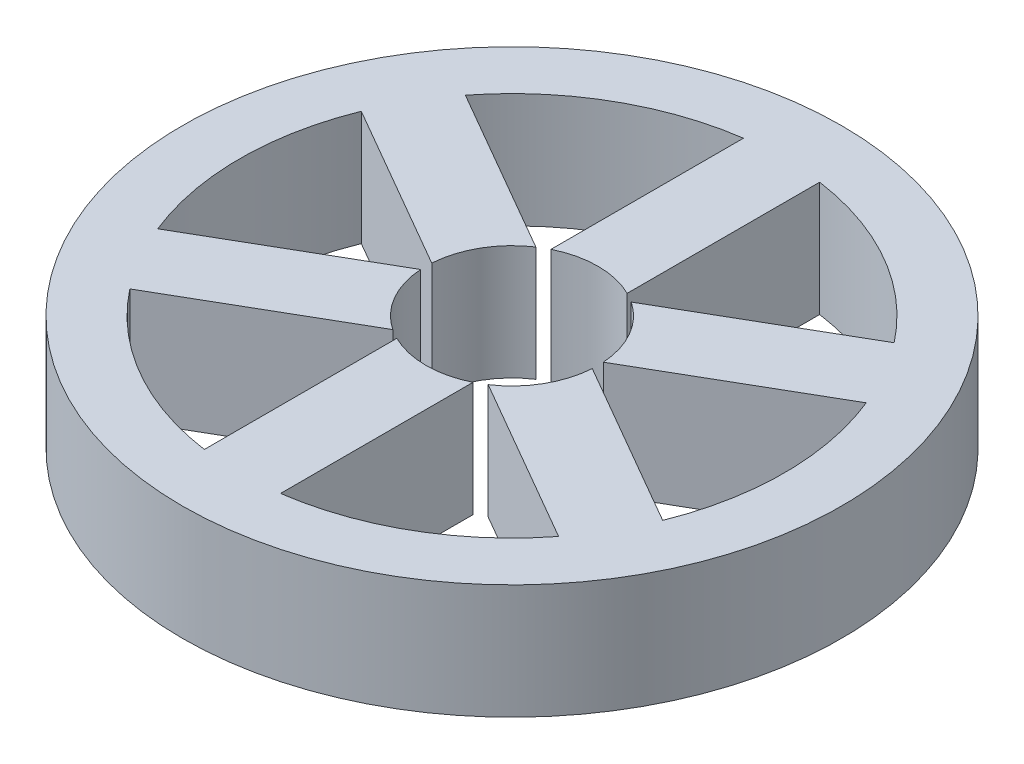
ISO-10303-21;
HEADER;
FILE_DESCRIPTION(('STEP AP214'),'2;1');
FILE_NAME('part.step','',(''),(''),'','','');
FILE_SCHEMA(('AUTOMOTIVE_DESIGN { 1 0 10303 214 1 1 1 1 }'));
ENDSEC;
DATA;
#1=APPLICATION_CONTEXT('core data for automotive mechanical design processes');
#2=APPLICATION_PROTOCOL_DEFINITION('international standard','automotive_design',2000,#1);
#3=PRODUCT_CONTEXT('',#1,'mechanical');
#4=PRODUCT('Part','Part','',(#3));
#5=PRODUCT_RELATED_PRODUCT_CATEGORY('part','',(#4));
#6=PRODUCT_DEFINITION_FORMATION('','',#4);
#7=PRODUCT_DEFINITION_CONTEXT('part definition',#1,'design');
#8=PRODUCT_DEFINITION('design','',#6,#7);
#9=PRODUCT_DEFINITION_SHAPE('','',#8);
#10=(LENGTH_UNIT() NAMED_UNIT(*) SI_UNIT(.MILLI.,.METRE.));
#11=(NAMED_UNIT(*) PLANE_ANGLE_UNIT() SI_UNIT($,.RADIAN.));
#12=(NAMED_UNIT(*) SI_UNIT($,.STERADIAN.) SOLID_ANGLE_UNIT());
#13=UNCERTAINTY_MEASURE_WITH_UNIT(LENGTH_MEASURE(1.E-05),#10,'distance_accuracy_value','');
#14=(GEOMETRIC_REPRESENTATION_CONTEXT(3) GLOBAL_UNCERTAINTY_ASSIGNED_CONTEXT((#13)) GLOBAL_UNIT_ASSIGNED_CONTEXT((#10,
#11,#12)) REPRESENTATION_CONTEXT('',''));
#15=CARTESIAN_POINT('',(0.,0.,0.));
#16=DIRECTION('',(0.,0.,1.));
#17=DIRECTION('',(1.,0.,0.));
#18=AXIS2_PLACEMENT_3D('',#15,#16,#17);
#19=CARTESIAN_POINT('',(0.,2.,0.));
#20=DIRECTION('',(0.,-1.,0.));
#21=DIRECTION('',(0.,0.,-1.));
#22=AXIS2_PLACEMENT_3D('',#19,#20,#21);
#23=CYLINDRICAL_SURFACE('',#22,4.75);
#24=CARTESIAN_POINT('',(0.,0.,0.));
#25=DIRECTION('',(0.,1.,0.));
#26=DIRECTION('',(0.,0.,1.));
#27=AXIS2_PLACEMENT_3D('',#24,#25,#26);
#28=CIRCLE('',#27,4.75);
#29=CARTESIAN_POINT('',(-3.74081986253042,0.,2.92724559203664));
#30=VERTEX_POINT('',#29);
#31=CARTESIAN_POINT('',(-0.664659114554616,0.,4.70326782795106));
#32=VERTEX_POINT('',#31);
#33=EDGE_CURVE('E285',#30,#32,#28,.T.);
#34=ORIENTED_EDGE('',*,*,#33,.F.);
#35=DIRECTION('',(0.,-1.,0.));
#36=VECTOR('',#35,1.);
#37=CARTESIAN_POINT('',(-3.74081986253042,2.,2.92724559203664));
#38=LINE('',#37,#36);
#39=CARTESIAN_POINT('',(-3.74081986253042,2.,2.92724559203664));
#40=VERTEX_POINT('',#39);
#41=EDGE_CURVE('E11',#40,#30,#38,.T.);
#42=ORIENTED_EDGE('',*,*,#41,.F.);
#43=CARTESIAN_POINT('',(0.,2.,0.));
#44=DIRECTION('',(0.,1.,0.));
#45=DIRECTION('',(0.,0.,1.));
#46=AXIS2_PLACEMENT_3D('',#43,#44,#45);
#47=CIRCLE('',#46,4.75);
#48=CARTESIAN_POINT('',(-0.664659114554616,2.,4.70326782795106));
#49=VERTEX_POINT('',#48);
#50=EDGE_CURVE('E243',#40,#49,#47,.T.);
#51=ORIENTED_EDGE('',*,*,#50,.T.);
#52=DIRECTION('',(0.,-1.,0.));
#53=VECTOR('',#52,1.);
#54=CARTESIAN_POINT('',(-0.664659114554616,2.,4.70326782795106));
#55=LINE('',#54,#53);
#56=EDGE_CURVE('E137',#49,#32,#55,.T.);
#57=ORIENTED_EDGE('',*,*,#56,.T.);
#58=EDGE_LOOP('',(#34,#42,#51,#57));
#59=FACE_BOUND('',#58,.T.);
#60=ADVANCED_FACE('F39',(#59),#23,.F.);
#61=CARTESIAN_POINT('',(0.332329557277286,2.,0.575611678061143));
#62=DIRECTION('',(0.499999999999992,0.,0.866025403784443));
#63=DIRECTION('',(0.866025403784443,0.,-0.499999999999992));
#64=AXIS2_PLACEMENT_3D('',#61,#62,#63);
#65=PLANE('',#64);
#66=DIRECTION('',(-0.866025403784443,0.,0.499999999999992));
#67=VECTOR('',#66,1.);
#68=CARTESIAN_POINT('',(0.332329557277286,0.,0.575611678061143));
#69=LINE('',#68,#67);
#70=CARTESIAN_POINT('',(-0.832218078536575,0.,1.2479635690824));
#71=VERTEX_POINT('',#70);
#72=EDGE_CURVE('E288',#71,#30,#69,.T.);
#73=ORIENTED_EDGE('',*,*,#72,.F.);
#74=DIRECTION('',(0.,-1.,0.));
#75=VECTOR('',#74,1.);
#76=CARTESIAN_POINT('',(-0.832218078536575,2.,1.2479635690824));
#77=LINE('',#76,#75);
#78=CARTESIAN_POINT('',(-0.832218078536575,2.,1.2479635690824));
#79=VERTEX_POINT('',#78);
#80=EDGE_CURVE('E47',#79,#71,#77,.T.);
#81=ORIENTED_EDGE('',*,*,#80,.F.);
#82=DIRECTION('',(-0.866025403784443,0.,0.499999999999992));
#83=VECTOR('',#82,1.);
#84=CARTESIAN_POINT('',(0.332329557277286,2.,0.575611678061143));
#85=LINE('',#84,#83);
#86=EDGE_CURVE('E237',#79,#40,#85,.T.);
#87=ORIENTED_EDGE('',*,*,#86,.T.);
#88=ORIENTED_EDGE('',*,*,#41,.T.);
#89=EDGE_LOOP('',(#73,#81,#87,#88));
#90=FACE_BOUND('',#89,.T.);
#91=ADVANCED_FACE('F390',(#90),#65,.T.);
#92=CARTESIAN_POINT('',(0.,2.,0.));
#93=DIRECTION('',(0.,-1.,0.));
#94=DIRECTION('',(0.,0.,-1.));
#95=AXIS2_PLACEMENT_3D('',#92,#93,#94);
#96=CYLINDRICAL_SURFACE('',#95,1.5);
#97=CARTESIAN_POINT('',(0.,0.,0.));
#98=DIRECTION('',(0.,1.,0.));
#99=DIRECTION('',(0.,0.,1.));
#100=AXIS2_PLACEMENT_3D('',#97,#98,#99);
#101=CIRCLE('',#100,1.5);
#102=CARTESIAN_POINT('',(-1.49687719309115,0.,0.0967402129601177));
#103=VERTEX_POINT('',#102);
#104=EDGE_CURVE('E291',#103,#71,#101,.T.);
#105=ORIENTED_EDGE('',*,*,#104,.F.);
#106=DIRECTION('',(0.,-1.,0.));
#107=VECTOR('',#106,1.);
#108=CARTESIAN_POINT('',(-1.49687719309115,2.,0.0967402129601177));
#109=LINE('',#108,#107);
#110=CARTESIAN_POINT('',(-1.49687719309115,2.,0.0967402129601177));
#111=VERTEX_POINT('',#110);
#112=EDGE_CURVE('E384',#111,#103,#109,.T.);
#113=ORIENTED_EDGE('',*,*,#112,.F.);
#114=CARTESIAN_POINT('',(0.,2.,0.));
#115=DIRECTION('',(0.,1.,0.));
#116=DIRECTION('',(0.,0.,1.));
#117=AXIS2_PLACEMENT_3D('',#114,#115,#116);
#118=CIRCLE('',#117,1.5);
#119=EDGE_CURVE('E226',#111,#79,#118,.T.);
#120=ORIENTED_EDGE('',*,*,#119,.T.);
#121=ORIENTED_EDGE('',*,*,#80,.T.);
#122=EDGE_LOOP('',(#105,#113,#120,#121));
#123=FACE_BOUND('',#122,.T.);
#124=ADVANCED_FACE('F387',(#123),#96,.F.);
#125=CARTESIAN_POINT('',(-0.332329557277286,2.,-0.575611678061143));
#126=DIRECTION('',(0.499999999999992,0.,0.866025403784443));
#127=DIRECTION('',(0.866025403784443,0.,-0.499999999999992));
#128=AXIS2_PLACEMENT_3D('',#125,#126,#127);
#129=PLANE('',#128);
#130=DIRECTION('',(-0.866025403784443,0.,0.499999999999992));
#131=VECTOR('',#130,1.);
#132=CARTESIAN_POINT('',(-0.332329557277286,0.,-0.575611678061143));
#133=LINE('',#132,#131);
#134=CARTESIAN_POINT('',(-4.40547897708499,0.,1.77602223591435));
#135=VERTEX_POINT('',#134);
#136=EDGE_CURVE('E294',#103,#135,#133,.T.);
#137=ORIENTED_EDGE('',*,*,#136,.T.);
#138=DIRECTION('',(0.,-1.,0.));
#139=VECTOR('',#138,1.);
#140=CARTESIAN_POINT('',(-4.40547897708499,2.,1.77602223591435));
#141=LINE('',#140,#139);
#142=CARTESIAN_POINT('',(-4.40547897708499,2.,1.77602223591435));
#143=VERTEX_POINT('',#142);
#144=EDGE_CURVE('E382',#143,#135,#141,.T.);
#145=ORIENTED_EDGE('',*,*,#144,.F.);
#146=DIRECTION('',(-0.866025403784443,0.,0.499999999999992));
#147=VECTOR('',#146,1.);
#148=CARTESIAN_POINT('',(-0.332329557277286,2.,-0.575611678061143));
#149=LINE('',#148,#147);
#150=EDGE_CURVE('E236',#111,#143,#149,.T.);
#151=ORIENTED_EDGE('',*,*,#150,.F.);
#152=ORIENTED_EDGE('',*,*,#112,.T.);
#153=EDGE_LOOP('',(#137,#145,#151,#152));
#154=FACE_BOUND('',#153,.T.);
#155=ADVANCED_FACE('F398',(#154),#129,.F.);
#156=CARTESIAN_POINT('',(0.,2.,0.));
#157=DIRECTION('',(0.,-1.,0.));
#158=DIRECTION('',(0.,0.,-1.));
#159=AXIS2_PLACEMENT_3D('',#156,#157,#158);
#160=CYLINDRICAL_SURFACE('',#159,4.75);
#161=CARTESIAN_POINT('',(0.,0.,0.));
#162=DIRECTION('',(0.,1.,0.));
#163=DIRECTION('',(0.,0.,1.));
#164=AXIS2_PLACEMENT_3D('',#161,#162,#163);
#165=CIRCLE('',#164,4.75);
#166=CARTESIAN_POINT('',(-4.40547897708495,0.,-1.77602223591444));
#167=VERTEX_POINT('',#166);
#168=EDGE_CURVE('E299',#167,#135,#165,.T.);
#169=ORIENTED_EDGE('',*,*,#168,.F.);
#170=DIRECTION('',(0.,-1.,0.));
#171=VECTOR('',#170,1.);
#172=CARTESIAN_POINT('',(-4.40547897708495,2.,-1.77602223591444));
#173=LINE('',#172,#171);
#174=CARTESIAN_POINT('',(-4.40547897708495,2.,-1.77602223591444));
#175=VERTEX_POINT('',#174);
#176=EDGE_CURVE('E380',#175,#167,#173,.T.);
#177=ORIENTED_EDGE('',*,*,#176,.F.);
#178=CARTESIAN_POINT('',(0.,2.,0.));
#179=DIRECTION('',(0.,1.,0.));
#180=DIRECTION('',(0.,0.,1.));
#181=AXIS2_PLACEMENT_3D('',#178,#179,#180);
#182=CIRCLE('',#181,4.75);
#183=EDGE_CURVE('E241',#175,#143,#182,.T.);
#184=ORIENTED_EDGE('',*,*,#183,.T.);
#185=ORIENTED_EDGE('',*,*,#144,.T.);
#186=EDGE_LOOP('',(#169,#177,#184,#185));
#187=FACE_BOUND('',#186,.T.);
#188=ADVANCED_FACE('F415',(#187),#160,.F.);
#189=CARTESIAN_POINT('',(-0.332329557277298,2.,0.575611678061136));
#190=DIRECTION('',(-0.50000000000001,0.,0.866025403784433));
#191=DIRECTION('',(0.866025403784433,0.,0.50000000000001));
#192=AXIS2_PLACEMENT_3D('',#189,#190,#191);
#193=PLANE('',#192);
#194=DIRECTION('',(-0.866025403784433,0.,-0.50000000000001));
#195=VECTOR('',#194,1.);
#196=CARTESIAN_POINT('',(-0.332329557277298,0.,0.575611678061136));
#197=LINE('',#196,#195);
#198=CARTESIAN_POINT('',(-1.49687719309115,0.,-0.0967402129601493));
#199=VERTEX_POINT('',#198);
#200=EDGE_CURVE('E302',#199,#167,#197,.T.);
#201=ORIENTED_EDGE('',*,*,#200,.F.);
#202=DIRECTION('',(0.,-1.,0.));
#203=VECTOR('',#202,1.);
#204=CARTESIAN_POINT('',(-1.49687719309115,2.,-0.0967402129601493));
#205=LINE('',#204,#203);
#206=CARTESIAN_POINT('',(-1.49687719309115,2.,-0.0967402129601493));
#207=VERTEX_POINT('',#206);
#208=EDGE_CURVE('E378',#207,#199,#205,.T.);
#209=ORIENTED_EDGE('',*,*,#208,.F.);
#210=DIRECTION('',(-0.866025403784433,0.,-0.50000000000001));
#211=VECTOR('',#210,1.);
#212=CARTESIAN_POINT('',(-0.332329557277298,2.,0.575611678061136));
#213=LINE('',#212,#211);
#214=EDGE_CURVE('E246',#207,#175,#213,.T.);
#215=ORIENTED_EDGE('',*,*,#214,.T.);
#216=ORIENTED_EDGE('',*,*,#176,.T.);
#217=EDGE_LOOP('',(#201,#209,#215,#216));
#218=FACE_BOUND('',#217,.T.);
#219=ADVANCED_FACE('F418',(#218),#193,.T.);
#220=CARTESIAN_POINT('',(-0.832218078536549,0.,-1.24796356908242));
#221=VERTEX_POINT('',#220);
#222=EDGE_CURVE('E296',#221,#199,#101,.T.);
#223=ORIENTED_EDGE('',*,*,#222,.F.);
#224=DIRECTION('',(0.,-1.,0.));
#225=VECTOR('',#224,1.);
#226=CARTESIAN_POINT('',(-0.832218078536549,2.,-1.24796356908242));
#227=LINE('',#226,#225);
#228=CARTESIAN_POINT('',(-0.832218078536549,2.,-1.24796356908242));
#229=VERTEX_POINT('',#228);
#230=EDGE_CURVE('E376',#229,#221,#227,.T.);
#231=ORIENTED_EDGE('',*,*,#230,.F.);
#232=EDGE_CURVE('E238',#229,#207,#118,.T.);
#233=ORIENTED_EDGE('',*,*,#232,.T.);
#234=ORIENTED_EDGE('',*,*,#208,.T.);
#235=EDGE_LOOP('',(#223,#231,#233,#234));
#236=FACE_BOUND('',#235,.T.);
#237=ADVANCED_FACE('F411',(#236),#96,.F.);
#238=CARTESIAN_POINT('',(0.332329557277298,2.,-0.575611678061136));
#239=DIRECTION('',(-0.50000000000001,0.,0.866025403784433));
#240=DIRECTION('',(0.866025403784433,0.,0.50000000000001));
#241=AXIS2_PLACEMENT_3D('',#238,#239,#240);
#242=PLANE('',#241);
#243=DIRECTION('',(-0.866025403784433,0.,-0.50000000000001));
#244=VECTOR('',#243,1.);
#245=CARTESIAN_POINT('',(0.332329557277298,0.,-0.575611678061136));
#246=LINE('',#245,#244);
#247=CARTESIAN_POINT('',(-3.74081986253036,0.,-2.92724559203672));
#248=VERTEX_POINT('',#247);
#249=EDGE_CURVE('E305',#221,#248,#246,.T.);
#250=ORIENTED_EDGE('',*,*,#249,.T.);
#251=DIRECTION('',(0.,-1.,0.));
#252=VECTOR('',#251,1.);
#253=CARTESIAN_POINT('',(-3.74081986253036,2.,-2.92724559203672));
#254=LINE('',#253,#252);
#255=CARTESIAN_POINT('',(-3.74081986253036,2.,-2.92724559203672));
#256=VERTEX_POINT('',#255);
#257=EDGE_CURVE('E374',#256,#248,#254,.T.);
#258=ORIENTED_EDGE('',*,*,#257,.F.);
#259=DIRECTION('',(-0.866025403784433,0.,-0.50000000000001));
#260=VECTOR('',#259,1.);
#261=CARTESIAN_POINT('',(0.332329557277298,2.,-0.575611678061136));
#262=LINE('',#261,#260);
#263=EDGE_CURVE('E245',#229,#256,#262,.T.);
#264=ORIENTED_EDGE('',*,*,#263,.F.);
#265=ORIENTED_EDGE('',*,*,#230,.T.);
#266=EDGE_LOOP('',(#250,#258,#264,#265));
#267=FACE_BOUND('',#266,.T.);
#268=ADVANCED_FACE('F423',(#267),#242,.F.);
#269=CARTESIAN_POINT('',(0.,2.,0.));
#270=DIRECTION('',(0.,-1.,0.));
#271=DIRECTION('',(0.,0.,-1.));
#272=AXIS2_PLACEMENT_3D('',#269,#270,#271);
#273=CYLINDRICAL_SURFACE('',#272,4.75);
#274=CARTESIAN_POINT('',(0.,0.,0.));
#275=DIRECTION('',(0.,1.,0.));
#276=DIRECTION('',(0.,0.,1.));
#277=AXIS2_PLACEMENT_3D('',#274,#275,#276);
#278=CIRCLE('',#277,4.75);
#279=CARTESIAN_POINT('',(-0.664659114554583,0.,-4.70326782795106));
#280=VERTEX_POINT('',#279);
#281=EDGE_CURVE('E308',#280,#248,#278,.T.);
#282=ORIENTED_EDGE('',*,*,#281,.F.);
#283=DIRECTION('',(0.,-1.,0.));
#284=VECTOR('',#283,1.);
#285=CARTESIAN_POINT('',(-0.664659114554583,2.,-4.70326782795106));
#286=LINE('',#285,#284);
#287=CARTESIAN_POINT('',(-0.664659114554583,2.,-4.70326782795106));
#288=VERTEX_POINT('',#287);
#289=EDGE_CURVE('E372',#288,#280,#286,.T.);
#290=ORIENTED_EDGE('',*,*,#289,.F.);
#291=CARTESIAN_POINT('',(0.,2.,0.));
#292=DIRECTION('',(0.,1.,0.));
#293=DIRECTION('',(0.,0.,1.));
#294=AXIS2_PLACEMENT_3D('',#291,#292,#293);
#295=CIRCLE('',#294,4.75);
#296=EDGE_CURVE('E250',#288,#256,#295,.T.);
#297=ORIENTED_EDGE('',*,*,#296,.T.);
#298=ORIENTED_EDGE('',*,*,#257,.T.);
#299=EDGE_LOOP('',(#282,#290,#297,#298));
#300=FACE_BOUND('',#299,.T.);
#301=ADVANCED_FACE('F426',(#300),#273,.F.);
#302=CARTESIAN_POINT('',(-0.664659114554583,2.,0.));
#303=DIRECTION('',(-1.,0.,0.));
#304=DIRECTION('',(0.,0.,1.));
#305=AXIS2_PLACEMENT_3D('',#302,#303,#304);
#306=PLANE('',#305);
#307=DIRECTION('',(0.,0.,-1.));
#308=VECTOR('',#307,1.);
#309=CARTESIAN_POINT('',(-0.664659114554583,0.,0.));
#310=LINE('',#309,#308);
#311=CARTESIAN_POINT('',(-0.664659114554583,0.,-1.34470378204254));
#312=VERTEX_POINT('',#311);
#313=EDGE_CURVE('E311',#312,#280,#310,.T.);
#314=ORIENTED_EDGE('',*,*,#313,.F.);
#315=DIRECTION('',(0.,-1.,0.));
#316=VECTOR('',#315,1.);
#317=CARTESIAN_POINT('',(-0.664659114554583,2.,-1.34470378204254));
#318=LINE('',#317,#316);
#319=CARTESIAN_POINT('',(-0.664659114554583,2.,-1.34470378204254));
#320=VERTEX_POINT('',#319);
#321=EDGE_CURVE('E370',#320,#312,#318,.T.);
#322=ORIENTED_EDGE('',*,*,#321,.F.);
#323=DIRECTION('',(0.,0.,-1.));
#324=VECTOR('',#323,1.);
#325=CARTESIAN_POINT('',(-0.664659114554583,2.,0.));
#326=LINE('',#325,#324);
#327=EDGE_CURVE('E256',#320,#288,#326,.T.);
#328=ORIENTED_EDGE('',*,*,#327,.T.);
#329=ORIENTED_EDGE('',*,*,#289,.T.);
#330=EDGE_LOOP('',(#314,#322,#328,#329));
#331=FACE_BOUND('',#330,.T.);
#332=ADVANCED_FACE('F430',(#331),#306,.T.);
#333=CARTESIAN_POINT('',(0.664659114554583,0.,-1.34470378204254));
#334=VERTEX_POINT('',#333);
#335=EDGE_CURVE('E314',#334,#312,#101,.T.);
#336=ORIENTED_EDGE('',*,*,#335,.F.);
#337=DIRECTION('',(0.,-1.,0.));
#338=VECTOR('',#337,1.);
#339=CARTESIAN_POINT('',(0.664659114554583,2.,-1.34470378204254));
#340=LINE('',#339,#338);
#341=CARTESIAN_POINT('',(0.664659114554583,2.,-1.34470378204254));
#342=VERTEX_POINT('',#341);
#343=EDGE_CURVE('E368',#342,#334,#340,.T.);
#344=ORIENTED_EDGE('',*,*,#343,.F.);
#345=EDGE_CURVE('E247',#342,#320,#118,.T.);
#346=ORIENTED_EDGE('',*,*,#345,.T.);
#347=ORIENTED_EDGE('',*,*,#321,.T.);
#348=EDGE_LOOP('',(#336,#344,#346,#347));
#349=FACE_BOUND('',#348,.T.);
#350=ADVANCED_FACE('F434',(#349),#96,.F.);
#351=CARTESIAN_POINT('',(0.664659114554583,2.,0.));
#352=DIRECTION('',(-1.,0.,0.));
#353=DIRECTION('',(0.,0.,1.));
#354=AXIS2_PLACEMENT_3D('',#351,#352,#353);
#355=PLANE('',#354);
#356=DIRECTION('',(0.,0.,-1.));
#357=VECTOR('',#356,1.);
#358=CARTESIAN_POINT('',(0.664659114554583,0.,0.));
#359=LINE('',#358,#357);
#360=CARTESIAN_POINT('',(0.664659114554583,0.,-4.70326782795106));
#361=VERTEX_POINT('',#360);
#362=EDGE_CURVE('E315',#334,#361,#359,.T.);
#363=ORIENTED_EDGE('',*,*,#362,.T.);
#364=DIRECTION('',(0.,-1.,0.));
#365=VECTOR('',#364,1.);
#366=CARTESIAN_POINT('',(0.664659114554583,2.,-4.70326782795106));
#367=LINE('',#366,#365);
#368=CARTESIAN_POINT('',(0.664659114554583,2.,-4.70326782795106));
#369=VERTEX_POINT('',#368);
#370=EDGE_CURVE('E366',#369,#361,#367,.T.);
#371=ORIENTED_EDGE('',*,*,#370,.F.);
#372=DIRECTION('',(0.,0.,-1.));
#373=VECTOR('',#372,1.);
#374=CARTESIAN_POINT('',(0.664659114554583,2.,0.));
#375=LINE('',#374,#373);
#376=EDGE_CURVE('E255',#342,#369,#375,.T.);
#377=ORIENTED_EDGE('',*,*,#376,.F.);
#378=ORIENTED_EDGE('',*,*,#343,.T.);
#379=EDGE_LOOP('',(#363,#371,#377,#378));
#380=FACE_BOUND('',#379,.T.);
#381=ADVANCED_FACE('F436',(#380),#355,.F.);
#382=CARTESIAN_POINT('',(0.,2.,0.));
#383=DIRECTION('',(0.,-1.,0.));
#384=DIRECTION('',(0.,0.,-1.));
#385=AXIS2_PLACEMENT_3D('',#382,#383,#384);
#386=CYLINDRICAL_SURFACE('',#385,4.75);
#387=CARTESIAN_POINT('',(0.,0.,0.));
#388=DIRECTION('',(0.,1.,0.));
#389=DIRECTION('',(0.,0.,1.));
#390=AXIS2_PLACEMENT_3D('',#387,#388,#389);
#391=CIRCLE('',#390,4.75);
#392=CARTESIAN_POINT('',(3.7408198625304,0.,-2.92724559203666));
#393=VERTEX_POINT('',#392);
#394=EDGE_CURVE('E318',#393,#361,#391,.T.);
#395=ORIENTED_EDGE('',*,*,#394,.F.);
#396=DIRECTION('',(0.,-1.,0.));
#397=VECTOR('',#396,1.);
#398=CARTESIAN_POINT('',(3.7408198625304,2.,-2.92724559203666));
#399=LINE('',#398,#397);
#400=CARTESIAN_POINT('',(3.7408198625304,2.,-2.92724559203666));
#401=VERTEX_POINT('',#400);
#402=EDGE_CURVE('E364',#401,#393,#399,.T.);
#403=ORIENTED_EDGE('',*,*,#402,.F.);
#404=CARTESIAN_POINT('',(0.,2.,0.));
#405=DIRECTION('',(0.,1.,0.));
#406=DIRECTION('',(0.,0.,1.));
#407=AXIS2_PLACEMENT_3D('',#404,#405,#406);
#408=CIRCLE('',#407,4.75);
#409=EDGE_CURVE('E259',#401,#369,#408,.T.);
#410=ORIENTED_EDGE('',*,*,#409,.T.);
#411=ORIENTED_EDGE('',*,*,#370,.T.);
#412=EDGE_LOOP('',(#395,#403,#410,#411));
#413=FACE_BOUND('',#412,.T.);
#414=ADVANCED_FACE('F439',(#413),#386,.F.);
#415=CARTESIAN_POINT('',(-0.33232955727729,2.,-0.575611678061141));
#416=DIRECTION('',(-0.499999999999998,0.,-0.86602540378444));
#417=DIRECTION('',(-0.86602540378444,0.,0.499999999999998));
#418=AXIS2_PLACEMENT_3D('',#415,#416,#417);
#419=PLANE('',#418);
#420=DIRECTION('',(0.86602540378444,0.,-0.499999999999998));
#421=VECTOR('',#420,1.);
#422=CARTESIAN_POINT('',(-0.33232955727729,0.,-0.575611678061141));
#423=LINE('',#422,#421);
#424=CARTESIAN_POINT('',(0.832218078536567,0.,-1.24796356908241));
#425=VERTEX_POINT('',#424);
#426=EDGE_CURVE('E321',#425,#393,#423,.T.);
#427=ORIENTED_EDGE('',*,*,#426,.F.);
#428=DIRECTION('',(0.,-1.,0.));
#429=VECTOR('',#428,1.);
#430=CARTESIAN_POINT('',(0.832218078536567,2.,-1.24796356908241));
#431=LINE('',#430,#429);
#432=CARTESIAN_POINT('',(0.832218078536567,2.,-1.24796356908241));
#433=VERTEX_POINT('',#432);
#434=EDGE_CURVE('E362',#433,#425,#431,.T.);
#435=ORIENTED_EDGE('',*,*,#434,.F.);
#436=DIRECTION('',(0.86602540378444,0.,-0.499999999999998));
#437=VECTOR('',#436,1.);
#438=CARTESIAN_POINT('',(-0.33232955727729,2.,-0.575611678061141));
#439=LINE('',#438,#437);
#440=EDGE_CURVE('E265',#433,#401,#439,.T.);
#441=ORIENTED_EDGE('',*,*,#440,.T.);
#442=ORIENTED_EDGE('',*,*,#402,.T.);
#443=EDGE_LOOP('',(#427,#435,#441,#442));
#444=FACE_BOUND('',#443,.T.);
#445=ADVANCED_FACE('F443',(#444),#419,.T.);
#446=CARTESIAN_POINT('',(1.49687719309115,0.,-0.0967402129601286));
#447=VERTEX_POINT('',#446);
#448=EDGE_CURVE('E324',#447,#425,#101,.T.);
#449=ORIENTED_EDGE('',*,*,#448,.F.);
#450=DIRECTION('',(0.,-1.,0.));
#451=VECTOR('',#450,1.);
#452=CARTESIAN_POINT('',(1.49687719309115,2.,-0.0967402129601286));
#453=LINE('',#452,#451);
#454=CARTESIAN_POINT('',(1.49687719309115,2.,-0.0967402129601286));
#455=VERTEX_POINT('',#454);
#456=EDGE_CURVE('E360',#455,#447,#453,.T.);
#457=ORIENTED_EDGE('',*,*,#456,.F.);
#458=EDGE_CURVE('E234',#455,#433,#118,.T.);
#459=ORIENTED_EDGE('',*,*,#458,.T.);
#460=ORIENTED_EDGE('',*,*,#434,.T.);
#461=EDGE_LOOP('',(#449,#457,#459,#460));
#462=FACE_BOUND('',#461,.T.);
#463=ADVANCED_FACE('F447',(#462),#96,.F.);
#464=CARTESIAN_POINT('',(0.33232955727729,2.,0.57561167806114));
#465=DIRECTION('',(-0.499999999999998,0.,-0.86602540378444));
#466=DIRECTION('',(-0.86602540378444,0.,0.499999999999998));
#467=AXIS2_PLACEMENT_3D('',#464,#465,#466);
#468=PLANE('',#467);
#469=DIRECTION('',(0.86602540378444,0.,-0.499999999999998));
#470=VECTOR('',#469,1.);
#471=CARTESIAN_POINT('',(0.33232955727729,0.,0.57561167806114));
#472=LINE('',#471,#470);
#473=CARTESIAN_POINT('',(4.40547897708497,0.,-1.77602223591438));
#474=VERTEX_POINT('',#473);
#475=EDGE_CURVE('E325',#447,#474,#472,.T.);
#476=ORIENTED_EDGE('',*,*,#475,.T.);
#477=DIRECTION('',(0.,-1.,0.));
#478=VECTOR('',#477,1.);
#479=CARTESIAN_POINT('',(4.40547897708497,2.,-1.77602223591438));
#480=LINE('',#479,#478);
#481=CARTESIAN_POINT('',(4.40547897708497,2.,-1.77602223591438));
#482=VERTEX_POINT('',#481);
#483=EDGE_CURVE('E358',#482,#474,#480,.T.);
#484=ORIENTED_EDGE('',*,*,#483,.F.);
#485=DIRECTION('',(0.86602540378444,0.,-0.499999999999998));
#486=VECTOR('',#485,1.);
#487=CARTESIAN_POINT('',(0.33232955727729,2.,0.57561167806114));
#488=LINE('',#487,#486);
#489=EDGE_CURVE('E264',#455,#482,#488,.T.);
#490=ORIENTED_EDGE('',*,*,#489,.F.);
#491=ORIENTED_EDGE('',*,*,#456,.T.);
#492=EDGE_LOOP('',(#476,#484,#490,#491));
#493=FACE_BOUND('',#492,.T.);
#494=ADVANCED_FACE('F448',(#493),#468,.F.);
#495=CARTESIAN_POINT('',(0.,2.,0.));
#496=DIRECTION('',(0.,-1.,0.));
#497=DIRECTION('',(0.,0.,-1.));
#498=AXIS2_PLACEMENT_3D('',#495,#496,#497);
#499=CYLINDRICAL_SURFACE('',#498,4.75);
#500=CARTESIAN_POINT('',(0.,0.,0.));
#501=DIRECTION('',(0.,1.,0.));
#502=DIRECTION('',(0.,0.,1.));
#503=AXIS2_PLACEMENT_3D('',#500,#501,#502);
#504=CIRCLE('',#503,4.75);
#505=CARTESIAN_POINT('',(4.40547897708496,0.,1.77602223591441));
#506=VERTEX_POINT('',#505);
#507=EDGE_CURVE('E328',#506,#474,#504,.T.);
#508=ORIENTED_EDGE('',*,*,#507,.F.);
#509=DIRECTION('',(0.,-1.,0.));
#510=VECTOR('',#509,1.);
#511=CARTESIAN_POINT('',(4.40547897708496,2.,1.77602223591441));
#512=LINE('',#511,#510);
#513=CARTESIAN_POINT('',(4.40547897708496,2.,1.77602223591441));
#514=VERTEX_POINT('',#513);
#515=EDGE_CURVE('E356',#514,#506,#512,.T.);
#516=ORIENTED_EDGE('',*,*,#515,.F.);
#517=CARTESIAN_POINT('',(0.,2.,0.));
#518=DIRECTION('',(0.,1.,0.));
#519=DIRECTION('',(0.,0.,1.));
#520=AXIS2_PLACEMENT_3D('',#517,#518,#519);
#521=CIRCLE('',#520,4.75);
#522=EDGE_CURVE('E268',#514,#482,#521,.T.);
#523=ORIENTED_EDGE('',*,*,#522,.T.);
#524=ORIENTED_EDGE('',*,*,#483,.T.);
#525=EDGE_LOOP('',(#508,#516,#523,#524));
#526=FACE_BOUND('',#525,.T.);
#527=ADVANCED_FACE('F451',(#526),#499,.F.);
#528=CARTESIAN_POINT('',(0.332329557277294,2.,-0.575611678061139));
#529=DIRECTION('',(0.500000000000004,0.,-0.866025403784436));
#530=DIRECTION('',(-0.866025403784436,0.,-0.500000000000004));
#531=AXIS2_PLACEMENT_3D('',#528,#529,#530);
#532=PLANE('',#531);
#533=DIRECTION('',(0.866025403784436,0.,0.500000000000004));
#534=VECTOR('',#533,1.);
#535=CARTESIAN_POINT('',(0.332329557277294,0.,-0.575611678061139));
#536=LINE('',#535,#534);
#537=CARTESIAN_POINT('',(1.49687719309115,0.,0.0967402129601382));
#538=VERTEX_POINT('',#537);
#539=EDGE_CURVE('E331',#538,#506,#536,.T.);
#540=ORIENTED_EDGE('',*,*,#539,.F.);
#541=DIRECTION('',(0.,-1.,0.));
#542=VECTOR('',#541,1.);
#543=CARTESIAN_POINT('',(1.49687719309115,2.,0.0967402129601382));
#544=LINE('',#543,#542);
#545=CARTESIAN_POINT('',(1.49687719309115,2.,0.0967402129601382));
#546=VERTEX_POINT('',#545);
#547=EDGE_CURVE('E354',#546,#538,#544,.T.);
#548=ORIENTED_EDGE('',*,*,#547,.F.);
#549=DIRECTION('',(0.866025403784436,0.,0.500000000000004));
#550=VECTOR('',#549,1.);
#551=CARTESIAN_POINT('',(0.332329557277294,2.,-0.575611678061139));
#552=LINE('',#551,#550);
#553=EDGE_CURVE('E233',#546,#514,#552,.T.);
#554=ORIENTED_EDGE('',*,*,#553,.T.);
#555=ORIENTED_EDGE('',*,*,#515,.T.);
#556=EDGE_LOOP('',(#540,#548,#554,#555));
#557=FACE_BOUND('',#556,.T.);
#558=ADVANCED_FACE('F455',(#557),#532,.T.);
#559=CARTESIAN_POINT('',(0.832218078536558,0.,1.24796356908241));
#560=VERTEX_POINT('',#559);
#561=EDGE_CURVE('E334',#560,#538,#101,.T.);
#562=ORIENTED_EDGE('',*,*,#561,.F.);
#563=DIRECTION('',(0.,-1.,0.));
#564=VECTOR('',#563,1.);
#565=CARTESIAN_POINT('',(0.832218078536558,2.,1.24796356908241));
#566=LINE('',#565,#564);
#567=CARTESIAN_POINT('',(0.832218078536558,2.,1.24796356908241));
#568=VERTEX_POINT('',#567);
#569=EDGE_CURVE('E352',#568,#560,#566,.T.);
#570=ORIENTED_EDGE('',*,*,#569,.F.);
#571=EDGE_CURVE('E225',#568,#546,#118,.T.);
#572=ORIENTED_EDGE('',*,*,#571,.T.);
#573=ORIENTED_EDGE('',*,*,#547,.T.);
#574=EDGE_LOOP('',(#562,#570,#572,#573));
#575=FACE_BOUND('',#574,.T.);
#576=ADVANCED_FACE('F459',(#575),#96,.F.);
#577=CARTESIAN_POINT('',(-0.332329557277294,2.,0.575611678061138));
#578=DIRECTION('',(0.500000000000004,0.,-0.866025403784436));
#579=DIRECTION('',(-0.866025403784436,0.,-0.500000000000004));
#580=AXIS2_PLACEMENT_3D('',#577,#578,#579);
#581=PLANE('',#580);
#582=DIRECTION('',(0.866025403784436,0.,0.500000000000004));
#583=VECTOR('',#582,1.);
#584=CARTESIAN_POINT('',(-0.332329557277294,0.,0.575611678061138));
#585=LINE('',#584,#583);
#586=CARTESIAN_POINT('',(3.74081986253037,0.,2.92724559203669));
#587=VERTEX_POINT('',#586);
#588=EDGE_CURVE('E335',#560,#587,#585,.T.);
#589=ORIENTED_EDGE('',*,*,#588,.T.);
#590=DIRECTION('',(0.,-1.,0.));
#591=VECTOR('',#590,1.);
#592=CARTESIAN_POINT('',(3.74081986253037,2.,2.92724559203669));
#593=LINE('',#592,#591);
#594=CARTESIAN_POINT('',(3.74081986253037,2.,2.92724559203669));
#595=VERTEX_POINT('',#594);
#596=EDGE_CURVE('E350',#595,#587,#593,.T.);
#597=ORIENTED_EDGE('',*,*,#596,.F.);
#598=DIRECTION('',(0.866025403784436,0.,0.500000000000004));
#599=VECTOR('',#598,1.);
#600=CARTESIAN_POINT('',(-0.332329557277294,2.,0.575611678061138));
#601=LINE('',#600,#599);
#602=EDGE_CURVE('E232',#568,#595,#601,.T.);
#603=ORIENTED_EDGE('',*,*,#602,.F.);
#604=ORIENTED_EDGE('',*,*,#569,.T.);
#605=EDGE_LOOP('',(#589,#597,#603,#604));
#606=FACE_BOUND('',#605,.T.);
#607=ADVANCED_FACE('F461',(#606),#581,.F.);
#608=CARTESIAN_POINT('',(0.,2.,0.));
#609=DIRECTION('',(0.,-1.,0.));
#610=DIRECTION('',(0.,0.,-1.));
#611=AXIS2_PLACEMENT_3D('',#608,#609,#610);
#612=CYLINDRICAL_SURFACE('',#611,4.75);
#613=CARTESIAN_POINT('',(0.,0.,0.));
#614=DIRECTION('',(0.,1.,0.));
#615=DIRECTION('',(0.,0.,1.));
#616=AXIS2_PLACEMENT_3D('',#613,#614,#615);
#617=CIRCLE('',#616,4.75);
#618=CARTESIAN_POINT('',(0.66465911455455,0.,4.70326782795107));
#619=VERTEX_POINT('',#618);
#620=EDGE_CURVE('E338',#619,#587,#617,.T.);
#621=ORIENTED_EDGE('',*,*,#620,.F.);
#622=DIRECTION('',(0.,-1.,0.));
#623=VECTOR('',#622,1.);
#624=CARTESIAN_POINT('',(0.66465911455455,2.,4.70326782795107));
#625=LINE('',#624,#623);
#626=CARTESIAN_POINT('',(0.66465911455455,2.,4.70326782795107));
#627=VERTEX_POINT('',#626);
#628=EDGE_CURVE('E214',#627,#619,#625,.T.);
#629=ORIENTED_EDGE('',*,*,#628,.F.);
#630=CARTESIAN_POINT('',(0.,2.,0.));
#631=DIRECTION('',(0.,1.,0.));
#632=DIRECTION('',(0.,0.,1.));
#633=AXIS2_PLACEMENT_3D('',#630,#631,#632);
#634=CIRCLE('',#633,4.75);
#635=EDGE_CURVE('E221',#627,#595,#634,.T.);
#636=ORIENTED_EDGE('',*,*,#635,.T.);
#637=ORIENTED_EDGE('',*,*,#596,.T.);
#638=EDGE_LOOP('',(#621,#629,#636,#637));
#639=FACE_BOUND('',#638,.T.);
#640=ADVANCED_FACE('F464',(#639),#612,.F.);
#641=CARTESIAN_POINT('',(0.664659114554583,2.,0.));
#642=DIRECTION('',(1.,0.,0.));
#643=DIRECTION('',(0.,0.,-1.));
#644=AXIS2_PLACEMENT_3D('',#641,#642,#643);
#645=PLANE('',#644);
#646=DIRECTION('',(0.,0.,1.));
#647=VECTOR('',#646,1.);
#648=CARTESIAN_POINT('',(0.664659114554583,0.,0.));
#649=LINE('',#648,#647);
#650=CARTESIAN_POINT('',(0.664659114554574,0.,1.34470378204255));
#651=VERTEX_POINT('',#650);
#652=EDGE_CURVE('E209',#651,#619,#649,.T.);
#653=ORIENTED_EDGE('',*,*,#652,.F.);
#654=DIRECTION('',(0.,-1.,0.));
#655=VECTOR('',#654,1.);
#656=CARTESIAN_POINT('',(0.664659114554574,2.,1.34470378204255));
#657=LINE('',#656,#655);
#658=CARTESIAN_POINT('',(0.664659114554574,2.,1.34470378204255));
#659=VERTEX_POINT('',#658);
#660=EDGE_CURVE('E204',#659,#651,#657,.T.);
#661=ORIENTED_EDGE('',*,*,#660,.F.);
#662=DIRECTION('',(0.,0.,1.));
#663=VECTOR('',#662,1.);
#664=CARTESIAN_POINT('',(0.664659114554583,2.,0.));
#665=LINE('',#664,#663);
#666=EDGE_CURVE('E207',#659,#627,#665,.T.);
#667=ORIENTED_EDGE('',*,*,#666,.T.);
#668=ORIENTED_EDGE('',*,*,#628,.T.);
#669=EDGE_LOOP('',(#653,#661,#667,#668));
#670=FACE_BOUND('',#669,.T.);
#671=ADVANCED_FACE('F206',(#670),#645,.T.);
#672=CARTESIAN_POINT('',(-0.664659114554592,0.,1.34470378204254));
#673=VERTEX_POINT('',#672);
#674=EDGE_CURVE('E295',#673,#651,#101,.T.);
#675=ORIENTED_EDGE('',*,*,#674,.F.);
#676=DIRECTION('',(0.,-1.,0.));
#677=VECTOR('',#676,1.);
#678=CARTESIAN_POINT('',(-0.664659114554592,2.,1.34470378204254));
#679=LINE('',#678,#677);
#680=CARTESIAN_POINT('',(-0.664659114554592,2.,1.34470378204254));
#681=VERTEX_POINT('',#680);
#682=EDGE_CURVE('E130',#681,#673,#679,.T.);
#683=ORIENTED_EDGE('',*,*,#682,.F.);
#684=EDGE_CURVE('E219',#681,#659,#118,.T.);
#685=ORIENTED_EDGE('',*,*,#684,.T.);
#686=ORIENTED_EDGE('',*,*,#660,.T.);
#687=EDGE_LOOP('',(#675,#683,#685,#686));
#688=FACE_BOUND('',#687,.T.);
#689=ADVANCED_FACE('F223',(#688),#96,.F.);
#690=CARTESIAN_POINT('',(-0.664659114554583,2.,0.));
#691=DIRECTION('',(1.,0.,0.));
#692=DIRECTION('',(0.,0.,-1.));
#693=AXIS2_PLACEMENT_3D('',#690,#691,#692);
#694=PLANE('',#693);
#695=DIRECTION('',(0.,0.,1.));
#696=VECTOR('',#695,1.);
#697=CARTESIAN_POINT('',(-0.664659114554583,0.,0.));
#698=LINE('',#697,#696);
#699=EDGE_CURVE('E342',#673,#32,#698,.T.);
#700=ORIENTED_EDGE('',*,*,#699,.T.);
#701=ORIENTED_EDGE('',*,*,#56,.F.);
#702=DIRECTION('',(0.,0.,1.));
#703=VECTOR('',#702,1.);
#704=CARTESIAN_POINT('',(-0.664659114554583,2.,0.));
#705=LINE('',#704,#703);
#706=EDGE_CURVE('E55',#681,#49,#705,.T.);
#707=ORIENTED_EDGE('',*,*,#706,.F.);
#708=ORIENTED_EDGE('',*,*,#682,.T.);
#709=EDGE_LOOP('',(#700,#701,#707,#708));
#710=FACE_BOUND('',#709,.T.);
#711=ADVANCED_FACE('F472',(#710),#694,.F.);
#712=CARTESIAN_POINT('',(0.,2.,0.));
#713=DIRECTION('',(0.,-1.,0.));
#714=DIRECTION('',(0.,0.,-1.));
#715=AXIS2_PLACEMENT_3D('',#712,#713,#714);
#716=CYLINDRICAL_SURFACE('',#715,5.75);
#717=CARTESIAN_POINT('',(0.,2.,0.));
#718=DIRECTION('',(0.,1.,0.));
#719=DIRECTION('',(0.,0.,1.));
#720=AXIS2_PLACEMENT_3D('',#717,#718,#719);
#721=CIRCLE('',#720,5.75);
#722=CARTESIAN_POINT('',(0.,2.,5.75));
#723=VERTEX_POINT('',#722);
#724=EDGE_CURVE('E227',#723,#723,#721,.T.);
#725=ORIENTED_EDGE('',*,*,#724,.F.);
#726=EDGE_LOOP('',(#725));
#727=FACE_BOUND('',#726,.T.);
#728=CARTESIAN_POINT('',(0.,0.,0.));
#729=DIRECTION('',(0.,1.,0.));
#730=DIRECTION('',(0.,0.,1.));
#731=AXIS2_PLACEMENT_3D('',#728,#729,#730);
#732=CIRCLE('',#731,5.75);
#733=CARTESIAN_POINT('',(0.,0.,5.75));
#734=VERTEX_POINT('',#733);
#735=EDGE_CURVE('E344',#734,#734,#732,.T.);
#736=ORIENTED_EDGE('',*,*,#735,.T.);
#737=EDGE_LOOP('',(#736));
#738=FACE_BOUND('',#737,.T.);
#739=ADVANCED_FACE('F475',(#727,#738),#716,.T.);
#740=CARTESIAN_POINT('',(0.,2.,0.));
#741=DIRECTION('',(0.,1.,0.));
#742=DIRECTION('',(0.,0.,1.));
#743=AXIS2_PLACEMENT_3D('',#740,#741,#742);
#744=PLANE('',#743);
#745=ORIENTED_EDGE('',*,*,#50,.F.);
#746=ORIENTED_EDGE('',*,*,#86,.F.);
#747=ORIENTED_EDGE('',*,*,#119,.F.);
#748=ORIENTED_EDGE('',*,*,#150,.T.);
#749=ORIENTED_EDGE('',*,*,#183,.F.);
#750=ORIENTED_EDGE('',*,*,#214,.F.);
#751=ORIENTED_EDGE('',*,*,#232,.F.);
#752=ORIENTED_EDGE('',*,*,#263,.T.);
#753=ORIENTED_EDGE('',*,*,#296,.F.);
#754=ORIENTED_EDGE('',*,*,#327,.F.);
#755=ORIENTED_EDGE('',*,*,#345,.F.);
#756=ORIENTED_EDGE('',*,*,#376,.T.);
#757=ORIENTED_EDGE('',*,*,#409,.F.);
#758=ORIENTED_EDGE('',*,*,#440,.F.);
#759=ORIENTED_EDGE('',*,*,#458,.F.);
#760=ORIENTED_EDGE('',*,*,#489,.T.);
#761=ORIENTED_EDGE('',*,*,#522,.F.);
#762=ORIENTED_EDGE('',*,*,#553,.F.);
#763=ORIENTED_EDGE('',*,*,#571,.F.);
#764=ORIENTED_EDGE('',*,*,#602,.T.);
#765=ORIENTED_EDGE('',*,*,#635,.F.);
#766=ORIENTED_EDGE('',*,*,#666,.F.);
#767=ORIENTED_EDGE('',*,*,#684,.F.);
#768=ORIENTED_EDGE('',*,*,#706,.T.);
#769=EDGE_LOOP('',(#745,#746,#747,#748,#749,#750,#751,#752,#753,#754,#755,#756,#757,#758,#759,
#760,#761,#762,#763,#764,#765,#766,#767,#768));
#770=FACE_BOUND('',#769,.T.);
#771=ORIENTED_EDGE('',*,*,#724,.T.);
#772=EDGE_LOOP('',(#771));
#773=FACE_BOUND('',#772,.T.);
#774=ADVANCED_FACE('F217',(#770,#773),#744,.T.);
#775=CARTESIAN_POINT('',(0.,0.,0.));
#776=DIRECTION('',(0.,1.,0.));
#777=DIRECTION('',(0.,0.,1.));
#778=AXIS2_PLACEMENT_3D('',#775,#776,#777);
#779=PLANE('',#778);
#780=ORIENTED_EDGE('',*,*,#33,.T.);
#781=ORIENTED_EDGE('',*,*,#699,.F.);
#782=ORIENTED_EDGE('',*,*,#674,.T.);
#783=ORIENTED_EDGE('',*,*,#652,.T.);
#784=ORIENTED_EDGE('',*,*,#620,.T.);
#785=ORIENTED_EDGE('',*,*,#588,.F.);
#786=ORIENTED_EDGE('',*,*,#561,.T.);
#787=ORIENTED_EDGE('',*,*,#539,.T.);
#788=ORIENTED_EDGE('',*,*,#507,.T.);
#789=ORIENTED_EDGE('',*,*,#475,.F.);
#790=ORIENTED_EDGE('',*,*,#448,.T.);
#791=ORIENTED_EDGE('',*,*,#426,.T.);
#792=ORIENTED_EDGE('',*,*,#394,.T.);
#793=ORIENTED_EDGE('',*,*,#362,.F.);
#794=ORIENTED_EDGE('',*,*,#335,.T.);
#795=ORIENTED_EDGE('',*,*,#313,.T.);
#796=ORIENTED_EDGE('',*,*,#281,.T.);
#797=ORIENTED_EDGE('',*,*,#249,.F.);
#798=ORIENTED_EDGE('',*,*,#222,.T.);
#799=ORIENTED_EDGE('',*,*,#200,.T.);
#800=ORIENTED_EDGE('',*,*,#168,.T.);
#801=ORIENTED_EDGE('',*,*,#136,.F.);
#802=ORIENTED_EDGE('',*,*,#104,.T.);
#803=ORIENTED_EDGE('',*,*,#72,.T.);
#804=EDGE_LOOP('',(#780,#781,#782,#783,#784,#785,#786,#787,#788,#789,#790,#791,#792,#793,#794,
#795,#796,#797,#798,#799,#800,#801,#802,#803));
#805=FACE_BOUND('',#804,.T.);
#806=ORIENTED_EDGE('',*,*,#735,.F.);
#807=EDGE_LOOP('',(#806));
#808=FACE_BOUND('',#807,.T.);
#809=ADVANCED_FACE('F393',(#805,#808),#779,.F.);
#810=CLOSED_SHELL('',(#60,#91,#124,#155,#188,#219,#237,#268,#301,#332,#350,#381,#414,#445,#463,
#494,#527,#558,#576,#607,#640,#671,#689,#711,#739,#774,#809));
#811=MANIFOLD_SOLID_BREP('B2',#810);
#812=ADVANCED_BREP_SHAPE_REPRESENTATION('',(#18,#811),#14);
#813=SHAPE_DEFINITION_REPRESENTATION(#9,#812);
ENDSEC;
END-ISO-10303-21;
